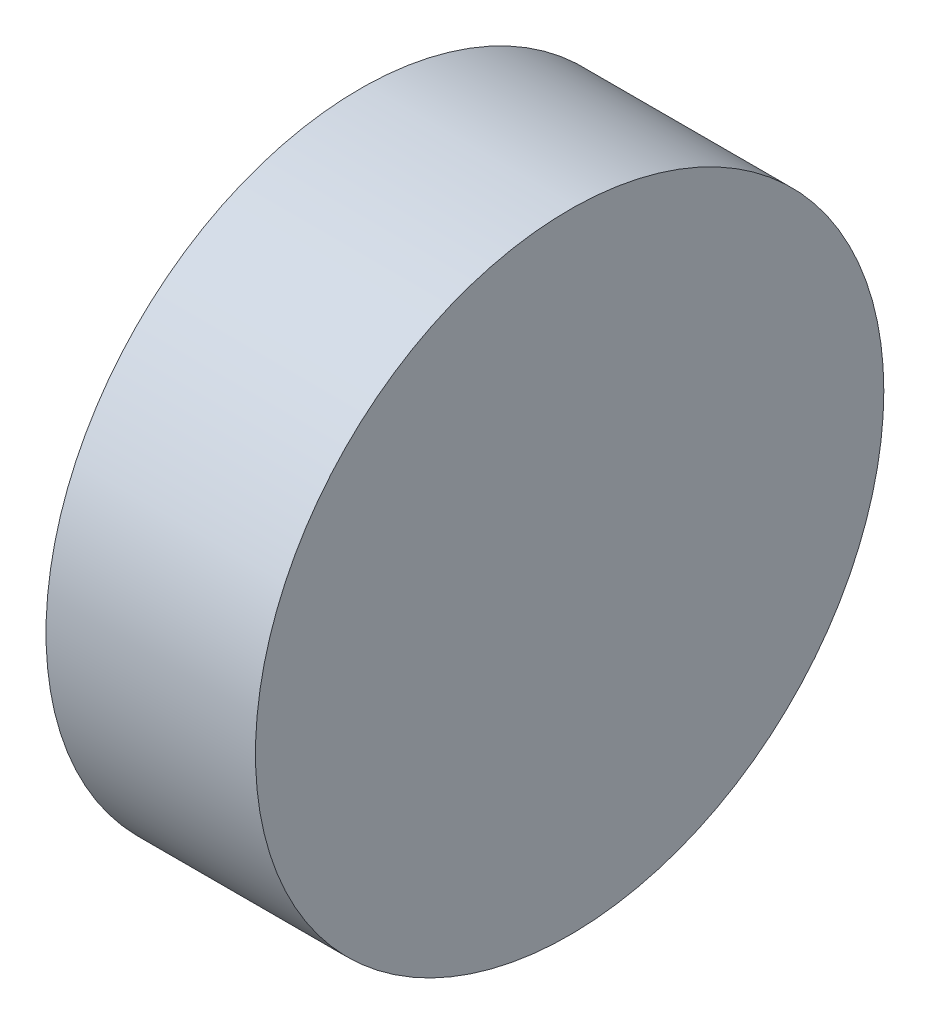
ISO-10303-21;
HEADER;
FILE_DESCRIPTION(('STEP AP214'),'2;1');
FILE_NAME('part.step','',(''),(''),'','','');
FILE_SCHEMA(('AUTOMOTIVE_DESIGN { 1 0 10303 214 1 1 1 1 }'));
ENDSEC;
DATA;
#1=APPLICATION_CONTEXT('core data for automotive mechanical design processes');
#2=APPLICATION_PROTOCOL_DEFINITION('international standard','automotive_design',2000,#1);
#3=PRODUCT_CONTEXT('',#1,'mechanical');
#4=PRODUCT('Part','Part','',(#3));
#5=PRODUCT_RELATED_PRODUCT_CATEGORY('part','',(#4));
#6=PRODUCT_DEFINITION_FORMATION('','',#4);
#7=PRODUCT_DEFINITION_CONTEXT('part definition',#1,'design');
#8=PRODUCT_DEFINITION('design','',#6,#7);
#9=PRODUCT_DEFINITION_SHAPE('','',#8);
#10=(LENGTH_UNIT() NAMED_UNIT(*) SI_UNIT(.MILLI.,.METRE.));
#11=(NAMED_UNIT(*) PLANE_ANGLE_UNIT() SI_UNIT($,.RADIAN.));
#12=(NAMED_UNIT(*) SI_UNIT($,.STERADIAN.) SOLID_ANGLE_UNIT());
#13=UNCERTAINTY_MEASURE_WITH_UNIT(LENGTH_MEASURE(1.E-05),#10,'distance_accuracy_value','');
#14=(GEOMETRIC_REPRESENTATION_CONTEXT(3) GLOBAL_UNCERTAINTY_ASSIGNED_CONTEXT((#13)) GLOBAL_UNIT_ASSIGNED_CONTEXT((#10,
#11,#12)) REPRESENTATION_CONTEXT('',''));
#15=CARTESIAN_POINT('',(0.,0.,0.));
#16=DIRECTION('',(0.,0.,1.));
#17=DIRECTION('',(1.,0.,0.));
#18=AXIS2_PLACEMENT_3D('',#15,#16,#17);
#19=CARTESIAN_POINT('',(2.,0.,0.));
#20=DIRECTION('',(-1.,0.,0.));
#21=DIRECTION('',(0.,0.,1.));
#22=AXIS2_PLACEMENT_3D('',#19,#20,#21);
#23=CYLINDRICAL_SURFACE('',#22,3.);
#24=CARTESIAN_POINT('',(2.,0.,0.));
#25=DIRECTION('',(1.,0.,0.));
#26=DIRECTION('',(0.,0.,-1.));
#27=AXIS2_PLACEMENT_3D('',#24,#25,#26);
#28=CIRCLE('',#27,3.);
#29=CARTESIAN_POINT('',(2.,0.,-3.));
#30=VERTEX_POINT('',#29);
#31=EDGE_CURVE('E10',#30,#30,#28,.T.);
#32=ORIENTED_EDGE('',*,*,#31,.F.);
#33=EDGE_LOOP('',(#32));
#34=FACE_BOUND('',#33,.T.);
#35=CARTESIAN_POINT('',(0.,0.,0.));
#36=DIRECTION('',(1.,0.,0.));
#37=DIRECTION('',(0.,0.,-1.));
#38=AXIS2_PLACEMENT_3D('',#35,#36,#37);
#39=CIRCLE('',#38,3.);
#40=CARTESIAN_POINT('',(0.,0.,-3.));
#41=VERTEX_POINT('',#40);
#42=EDGE_CURVE('E42',#41,#41,#39,.T.);
#43=ORIENTED_EDGE('',*,*,#42,.T.);
#44=EDGE_LOOP('',(#43));
#45=FACE_BOUND('',#44,.T.);
#46=ADVANCED_FACE('F39',(#34,#45),#23,.T.);
#47=CARTESIAN_POINT('',(2.,0.,0.));
#48=DIRECTION('',(1.,0.,0.));
#49=DIRECTION('',(0.,0.,-1.));
#50=AXIS2_PLACEMENT_3D('',#47,#48,#49);
#51=PLANE('',#50);
#52=ORIENTED_EDGE('',*,*,#31,.T.);
#53=EDGE_LOOP('',(#52));
#54=FACE_BOUND('',#53,.T.);
#55=ADVANCED_FACE('F54',(#54),#51,.T.);
#56=CARTESIAN_POINT('',(0.,0.,0.));
#57=DIRECTION('',(1.,0.,0.));
#58=DIRECTION('',(0.,0.,-1.));
#59=AXIS2_PLACEMENT_3D('',#56,#57,#58);
#60=PLANE('',#59);
#61=ORIENTED_EDGE('',*,*,#42,.F.);
#62=EDGE_LOOP('',(#61));
#63=FACE_BOUND('',#62,.T.);
#64=ADVANCED_FACE('F52',(#63),#60,.F.);
#65=CLOSED_SHELL('',(#46,#55,#64));
#66=MANIFOLD_SOLID_BREP('B2',#65);
#67=ADVANCED_BREP_SHAPE_REPRESENTATION('',(#18,#66),#14);
#68=SHAPE_DEFINITION_REPRESENTATION(#9,#67);
ENDSEC;
END-ISO-10303-21;
